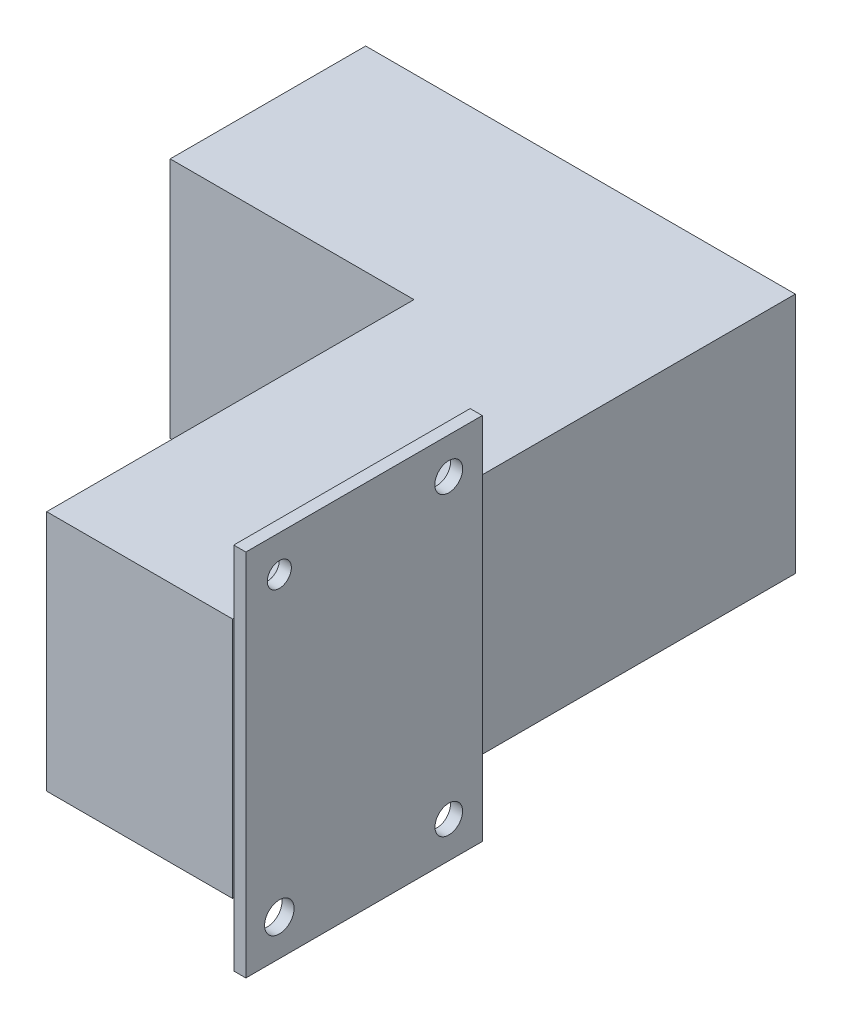
ISO-10303-21;
HEADER;
FILE_DESCRIPTION(('STEP AP214'),'2;1');
FILE_NAME('part.step','',(''),(''),'','','');
FILE_SCHEMA(('AUTOMOTIVE_DESIGN { 1 0 10303 214 1 1 1 1 }'));
ENDSEC;
DATA;
#1=APPLICATION_CONTEXT('core data for automotive mechanical design processes');
#2=APPLICATION_PROTOCOL_DEFINITION('international standard','automotive_design',2000,#1);
#3=PRODUCT_CONTEXT('',#1,'mechanical');
#4=PRODUCT('Part','Part','',(#3));
#5=PRODUCT_RELATED_PRODUCT_CATEGORY('part','',(#4));
#6=PRODUCT_DEFINITION_FORMATION('','',#4);
#7=PRODUCT_DEFINITION_CONTEXT('part definition',#1,'design');
#8=PRODUCT_DEFINITION('design','',#6,#7);
#9=PRODUCT_DEFINITION_SHAPE('','',#8);
#10=(LENGTH_UNIT() NAMED_UNIT(*) SI_UNIT(.MILLI.,.METRE.));
#11=(NAMED_UNIT(*) PLANE_ANGLE_UNIT() SI_UNIT($,.RADIAN.));
#12=(NAMED_UNIT(*) SI_UNIT($,.STERADIAN.) SOLID_ANGLE_UNIT());
#13=UNCERTAINTY_MEASURE_WITH_UNIT(LENGTH_MEASURE(1.E-05),#10,'distance_accuracy_value','');
#14=(GEOMETRIC_REPRESENTATION_CONTEXT(3) GLOBAL_UNCERTAINTY_ASSIGNED_CONTEXT((#13)) GLOBAL_UNIT_ASSIGNED_CONTEXT((#10,
#11,#12)) REPRESENTATION_CONTEXT('',''));
#15=CARTESIAN_POINT('',(0.,0.,0.));
#16=DIRECTION('',(0.,0.,1.));
#17=DIRECTION('',(1.,0.,0.));
#18=AXIS2_PLACEMENT_3D('',#15,#16,#17);
#19=CARTESIAN_POINT('',(35.5,-20.,93.));
#20=DIRECTION('',(-1.,0.,0.));
#21=DIRECTION('',(0.,0.,1.));
#22=AXIS2_PLACEMENT_3D('',#19,#20,#21);
#23=PLANE('',#22);
#24=DIRECTION('',(0.,1.,0.));
#25=VECTOR('',#24,1.);
#26=CARTESIAN_POINT('',(35.5,-20.,53.7347753333379));
#27=LINE('',#26,#25);
#28=CARTESIAN_POINT('',(35.5,-20.,53.7347753333379));
#29=VERTEX_POINT('',#28);
#30=CARTESIAN_POINT('',(35.5,20.,53.7347753333379));
#31=VERTEX_POINT('',#30);
#32=EDGE_CURVE('E61',#29,#31,#27,.T.);
#33=ORIENTED_EDGE('',*,*,#32,.F.);
#34=DIRECTION('',(0.,0.,-1.));
#35=VECTOR('',#34,1.);
#36=CARTESIAN_POINT('',(35.5,-20.,93.));
#37=LINE('',#36,#35);
#38=CARTESIAN_POINT('',(35.5,-20.,0.));
#39=VERTEX_POINT('',#38);
#40=EDGE_CURVE('E147',#29,#39,#37,.T.);
#41=ORIENTED_EDGE('',*,*,#40,.T.);
#42=DIRECTION('',(0.,1.,0.));
#43=VECTOR('',#42,1.);
#44=CARTESIAN_POINT('',(35.5,-20.,0.));
#45=LINE('',#44,#43);
#46=CARTESIAN_POINT('',(35.5,20.,0.));
#47=VERTEX_POINT('',#46);
#48=EDGE_CURVE('E153',#39,#47,#45,.T.);
#49=ORIENTED_EDGE('',*,*,#48,.T.);
#50=DIRECTION('',(0.,0.,-1.));
#51=VECTOR('',#50,1.);
#52=CARTESIAN_POINT('',(35.5,20.,93.));
#53=LINE('',#52,#51);
#54=EDGE_CURVE('E172',#31,#47,#53,.T.);
#55=ORIENTED_EDGE('',*,*,#54,.F.);
#56=EDGE_LOOP('',(#33,#41,#49,#55));
#57=FACE_BOUND('',#56,.T.);
#58=ADVANCED_FACE('F39',(#57),#23,.F.);
#59=DIRECTION('',(0.,-1.,0.));
#60=VECTOR('',#59,1.);
#61=CARTESIAN_POINT('',(35.5,-20.,92.7987415941625));
#62=LINE('',#61,#60);
#63=CARTESIAN_POINT('',(35.5,20.,92.7987415941625));
#64=VERTEX_POINT('',#63);
#65=CARTESIAN_POINT('',(35.5,-20.,92.7987415941625));
#66=VERTEX_POINT('',#65);
#67=EDGE_CURVE('E174',#64,#66,#62,.T.);
#68=ORIENTED_EDGE('',*,*,#67,.F.);
#69=CARTESIAN_POINT('',(35.5,20.,93.));
#70=VERTEX_POINT('',#69);
#71=EDGE_CURVE('E173',#70,#64,#53,.T.);
#72=ORIENTED_EDGE('',*,*,#71,.F.);
#73=DIRECTION('',(0.,1.,0.));
#74=VECTOR('',#73,1.);
#75=CARTESIAN_POINT('',(35.5,-20.,93.));
#76=LINE('',#75,#74);
#77=CARTESIAN_POINT('',(35.5,-20.,93.));
#78=VERTEX_POINT('',#77);
#79=EDGE_CURVE('E143',#78,#70,#76,.T.);
#80=ORIENTED_EDGE('',*,*,#79,.F.);
#81=EDGE_CURVE('E165',#78,#66,#37,.T.);
#82=ORIENTED_EDGE('',*,*,#81,.T.);
#83=EDGE_LOOP('',(#68,#72,#80,#82));
#84=FACE_BOUND('',#83,.T.);
#85=ADVANCED_FACE('F285',(#84),#23,.F.);
#86=CARTESIAN_POINT('',(-35.5,20.,93.));
#87=DIRECTION('',(0.,-1.,0.));
#88=DIRECTION('',(0.,0.,-1.));
#89=AXIS2_PLACEMENT_3D('',#86,#87,#88);
#90=PLANE('',#89);
#91=DIRECTION('',(0.,0.,-1.));
#92=VECTOR('',#91,1.);
#93=CARTESIAN_POINT('',(-35.5,20.,93.));
#94=LINE('',#93,#92);
#95=CARTESIAN_POINT('',(-35.5,20.,32.3048927782938));
#96=VERTEX_POINT('',#95);
#97=CARTESIAN_POINT('',(-35.5,20.,0.));
#98=VERTEX_POINT('',#97);
#99=EDGE_CURVE('E170',#96,#98,#94,.T.);
#100=ORIENTED_EDGE('',*,*,#99,.F.);
#101=DIRECTION('',(-1.,0.,0.));
#102=VECTOR('',#101,1.);
#103=CARTESIAN_POINT('',(4.7864678034472,20.,32.3048927782938));
#104=LINE('',#103,#102);
#105=CARTESIAN_POINT('',(4.7864678034472,20.,32.3048927782938));
#106=VERTEX_POINT('',#105);
#107=EDGE_CURVE('E139',#106,#96,#104,.T.);
#108=ORIENTED_EDGE('',*,*,#107,.F.);
#109=DIRECTION('',(0.,0.,-1.));
#110=VECTOR('',#109,1.);
#111=CARTESIAN_POINT('',(4.7864678034472,20.,93.));
#112=LINE('',#111,#110);
#113=CARTESIAN_POINT('',(4.7864678034472,20.,93.));
#114=VERTEX_POINT('',#113);
#115=EDGE_CURVE('E128',#114,#106,#112,.T.);
#116=ORIENTED_EDGE('',*,*,#115,.F.);
#117=DIRECTION('',(-1.,0.,0.));
#118=VECTOR('',#117,1.);
#119=CARTESIAN_POINT('',(-35.5,20.,93.));
#120=LINE('',#119,#118);
#121=EDGE_CURVE('E137',#70,#114,#120,.T.);
#122=ORIENTED_EDGE('',*,*,#121,.F.);
#123=ORIENTED_EDGE('',*,*,#71,.T.);
#124=EDGE_CURVE('E175',#64,#31,#53,.T.);
#125=ORIENTED_EDGE('',*,*,#124,.T.);
#126=ORIENTED_EDGE('',*,*,#54,.T.);
#127=DIRECTION('',(-1.,0.,0.));
#128=VECTOR('',#127,1.);
#129=CARTESIAN_POINT('',(-35.5,20.,0.));
#130=LINE('',#129,#128);
#131=EDGE_CURVE('E156',#47,#98,#130,.T.);
#132=ORIENTED_EDGE('',*,*,#131,.T.);
#133=EDGE_LOOP('',(#100,#108,#116,#122,#123,#125,#126,#132));
#134=FACE_BOUND('',#133,.T.);
#135=ADVANCED_FACE('F135',(#134),#90,.F.);
#136=CARTESIAN_POINT('',(-35.5,-20.,93.));
#137=DIRECTION('',(1.,0.,0.));
#138=DIRECTION('',(0.,0.,-1.));
#139=AXIS2_PLACEMENT_3D('',#136,#137,#138);
#140=PLANE('',#139);
#141=DIRECTION('',(0.,0.,-1.));
#142=VECTOR('',#141,1.);
#143=CARTESIAN_POINT('',(-35.5,-20.,93.));
#144=LINE('',#143,#142);
#145=CARTESIAN_POINT('',(-35.5,-20.,32.3048927782938));
#146=VERTEX_POINT('',#145);
#147=CARTESIAN_POINT('',(-35.5,-20.,0.));
#148=VERTEX_POINT('',#147);
#149=EDGE_CURVE('E167',#146,#148,#144,.T.);
#150=ORIENTED_EDGE('',*,*,#149,.F.);
#151=DIRECTION('',(0.,1.,0.));
#152=VECTOR('',#151,1.);
#153=CARTESIAN_POINT('',(-35.5,-47.,32.3048927782938));
#154=LINE('',#153,#152);
#155=EDGE_CURVE('E197',#146,#96,#154,.T.);
#156=ORIENTED_EDGE('',*,*,#155,.T.);
#157=ORIENTED_EDGE('',*,*,#99,.T.);
#158=DIRECTION('',(0.,-1.,0.));
#159=VECTOR('',#158,1.);
#160=CARTESIAN_POINT('',(-35.5,-20.,0.));
#161=LINE('',#160,#159);
#162=EDGE_CURVE('E160',#98,#148,#161,.T.);
#163=ORIENTED_EDGE('',*,*,#162,.T.);
#164=EDGE_LOOP('',(#150,#156,#157,#163));
#165=FACE_BOUND('',#164,.T.);
#166=ADVANCED_FACE('F196',(#165),#140,.F.);
#167=CARTESIAN_POINT('',(-35.5,-20.,93.));
#168=DIRECTION('',(0.,1.,0.));
#169=DIRECTION('',(0.,0.,1.));
#170=AXIS2_PLACEMENT_3D('',#167,#168,#169);
#171=PLANE('',#170);
#172=DIRECTION('',(0.,0.,-1.));
#173=VECTOR('',#172,1.);
#174=CARTESIAN_POINT('',(4.7864678034472,-20.,93.));
#175=LINE('',#174,#173);
#176=CARTESIAN_POINT('',(4.7864678034472,-20.,93.));
#177=VERTEX_POINT('',#176);
#178=CARTESIAN_POINT('',(4.7864678034472,-20.,32.3048927782938));
#179=VERTEX_POINT('',#178);
#180=EDGE_CURVE('E53',#177,#179,#175,.T.);
#181=ORIENTED_EDGE('',*,*,#180,.T.);
#182=DIRECTION('',(-1.,0.,0.));
#183=VECTOR('',#182,1.);
#184=CARTESIAN_POINT('',(-35.5,-20.,32.3048927782938));
#185=LINE('',#184,#183);
#186=EDGE_CURVE('E11',#179,#146,#185,.T.);
#187=ORIENTED_EDGE('',*,*,#186,.T.);
#188=ORIENTED_EDGE('',*,*,#149,.T.);
#189=DIRECTION('',(1.,0.,0.));
#190=VECTOR('',#189,1.);
#191=CARTESIAN_POINT('',(-35.5,-20.,0.));
#192=LINE('',#191,#190);
#193=EDGE_CURVE('E149',#148,#39,#192,.T.);
#194=ORIENTED_EDGE('',*,*,#193,.T.);
#195=ORIENTED_EDGE('',*,*,#40,.F.);
#196=EDGE_CURVE('E168',#66,#29,#37,.T.);
#197=ORIENTED_EDGE('',*,*,#196,.F.);
#198=ORIENTED_EDGE('',*,*,#81,.F.);
#199=DIRECTION('',(1.,0.,0.));
#200=VECTOR('',#199,1.);
#201=CARTESIAN_POINT('',(-35.5,-20.,93.));
#202=LINE('',#201,#200);
#203=EDGE_CURVE('E145',#177,#78,#202,.T.);
#204=ORIENTED_EDGE('',*,*,#203,.F.);
#205=EDGE_LOOP('',(#181,#187,#188,#194,#195,#197,#198,#204));
#206=FACE_BOUND('',#205,.T.);
#207=ADVANCED_FACE('F192',(#206),#171,.F.);
#208=CARTESIAN_POINT('',(0.,0.,93.));
#209=DIRECTION('',(0.,0.,-1.));
#210=DIRECTION('',(-1.,0.,0.));
#211=AXIS2_PLACEMENT_3D('',#208,#209,#210);
#212=PLANE('',#211);
#213=ORIENTED_EDGE('',*,*,#121,.T.);
#214=DIRECTION('',(0.,-1.,0.));
#215=VECTOR('',#214,1.);
#216=CARTESIAN_POINT('',(4.7864678034472,0.,93.));
#217=LINE('',#216,#215);
#218=EDGE_CURVE('E46',#114,#177,#217,.T.);
#219=ORIENTED_EDGE('',*,*,#218,.T.);
#220=ORIENTED_EDGE('',*,*,#203,.T.);
#221=ORIENTED_EDGE('',*,*,#79,.T.);
#222=EDGE_LOOP('',(#213,#219,#220,#221));
#223=FACE_BOUND('',#222,.T.);
#224=ADVANCED_FACE('F141',(#223),#212,.F.);
#225=CARTESIAN_POINT('',(0.,0.,0.));
#226=DIRECTION('',(0.,0.,-1.));
#227=DIRECTION('',(-1.,0.,0.));
#228=AXIS2_PLACEMENT_3D('',#225,#226,#227);
#229=PLANE('',#228);
#230=ORIENTED_EDGE('',*,*,#48,.F.);
#231=ORIENTED_EDGE('',*,*,#193,.F.);
#232=ORIENTED_EDGE('',*,*,#162,.F.);
#233=ORIENTED_EDGE('',*,*,#131,.F.);
#234=EDGE_LOOP('',(#230,#231,#232,#233));
#235=FACE_BOUND('',#234,.T.);
#236=ADVANCED_FACE('F187',(#235),#229,.T.);
#237=CARTESIAN_POINT('',(35.5,0.,0.));
#238=DIRECTION('',(1.,0.,0.));
#239=DIRECTION('',(0.,0.,-1.));
#240=AXIS2_PLACEMENT_3D('',#237,#238,#239);
#241=PLANE('',#240);
#242=CARTESIAN_POINT('',(35.5,-24.5,87.2667584637502));
#243=DIRECTION('',(-1.,0.,0.));
#244=DIRECTION('',(0.,0.,1.));
#245=AXIS2_PLACEMENT_3D('',#242,#243,#244);
#246=CIRCLE('',#245,2.43555370347675);
#247=CARTESIAN_POINT('',(35.5,-24.5,89.7023121672269));
#248=VERTEX_POINT('',#247);
#249=EDGE_CURVE('E209',#248,#248,#246,.T.);
#250=ORIENTED_EDGE('',*,*,#249,.F.);
#251=EDGE_LOOP('',(#250));
#252=FACE_BOUND('',#251,.T.);
#253=CARTESIAN_POINT('',(35.5,-24.5,59.2667584637502));
#254=DIRECTION('',(-1.,0.,0.));
#255=DIRECTION('',(0.,0.,1.));
#256=AXIS2_PLACEMENT_3D('',#253,#254,#255);
#257=CIRCLE('',#256,2.27958657246223);
#258=CARTESIAN_POINT('',(35.5,-24.5,61.5463450362124));
#259=VERTEX_POINT('',#258);
#260=EDGE_CURVE('E201',#259,#259,#257,.T.);
#261=ORIENTED_EDGE('',*,*,#260,.F.);
#262=EDGE_LOOP('',(#261));
#263=FACE_BOUND('',#262,.T.);
#264=CARTESIAN_POINT('',(35.5,-30.4802785253419,92.7987415941625));
#265=VERTEX_POINT('',#264);
#266=EDGE_CURVE('E181',#66,#265,#62,.T.);
#267=ORIENTED_EDGE('',*,*,#266,.F.);
#268=ORIENTED_EDGE('',*,*,#196,.T.);
#269=CARTESIAN_POINT('',(35.5,-30.4802785253419,53.7347753333379));
#270=VERTEX_POINT('',#269);
#271=EDGE_CURVE('E241',#270,#29,#27,.T.);
#272=ORIENTED_EDGE('',*,*,#271,.F.);
#273=DIRECTION('',(0.,0.,-1.));
#274=VECTOR('',#273,1.);
#275=CARTESIAN_POINT('',(35.5,-30.4802785253419,93.));
#276=LINE('',#275,#274);
#277=EDGE_CURVE('E234',#265,#270,#276,.T.);
#278=ORIENTED_EDGE('',*,*,#277,.F.);
#279=EDGE_LOOP('',(#267,#268,#272,#278));
#280=FACE_BOUND('',#279,.T.);
#281=ADVANCED_FACE('F282',(#252,#263,#280),#241,.F.);
#282=CARTESIAN_POINT('',(37.5,-20.,53.7347753333379));
#283=DIRECTION('',(0.,0.,1.));
#284=DIRECTION('',(1.,0.,0.));
#285=AXIS2_PLACEMENT_3D('',#282,#283,#284);
#286=PLANE('',#285);
#287=ORIENTED_EDGE('',*,*,#271,.T.);
#288=ORIENTED_EDGE('',*,*,#32,.T.);
#289=CARTESIAN_POINT('',(35.5,30.4802785253419,53.7347753333379));
#290=VERTEX_POINT('',#289);
#291=EDGE_CURVE('E227',#31,#290,#27,.T.);
#292=ORIENTED_EDGE('',*,*,#291,.T.);
#293=DIRECTION('',(-1.,0.,0.));
#294=VECTOR('',#293,1.);
#295=CARTESIAN_POINT('',(37.5,30.4802785253419,53.7347753333379));
#296=LINE('',#295,#294);
#297=CARTESIAN_POINT('',(37.5,30.4802785253419,53.7347753333379));
#298=VERTEX_POINT('',#297);
#299=EDGE_CURVE('E157',#298,#290,#296,.T.);
#300=ORIENTED_EDGE('',*,*,#299,.F.);
#301=DIRECTION('',(0.,1.,0.));
#302=VECTOR('',#301,1.);
#303=CARTESIAN_POINT('',(37.5,-20.,53.7347753333379));
#304=LINE('',#303,#302);
#305=CARTESIAN_POINT('',(37.5,-30.4802785253419,53.7347753333379));
#306=VERTEX_POINT('',#305);
#307=EDGE_CURVE('E230',#306,#298,#304,.T.);
#308=ORIENTED_EDGE('',*,*,#307,.F.);
#309=DIRECTION('',(-1.,0.,0.));
#310=VECTOR('',#309,1.);
#311=CARTESIAN_POINT('',(37.5,-30.4802785253419,53.7347753333379));
#312=LINE('',#311,#310);
#313=EDGE_CURVE('E240',#306,#270,#312,.T.);
#314=ORIENTED_EDGE('',*,*,#313,.T.);
#315=EDGE_LOOP('',(#287,#288,#292,#300,#308,#314));
#316=FACE_BOUND('',#315,.T.);
#317=ADVANCED_FACE('F263',(#316),#286,.F.);
#318=CARTESIAN_POINT('',(37.5,30.4802785253419,93.));
#319=DIRECTION('',(0.,-1.,0.));
#320=DIRECTION('',(0.,0.,-1.));
#321=AXIS2_PLACEMENT_3D('',#318,#319,#320);
#322=PLANE('',#321);
#323=DIRECTION('',(0.,0.,1.));
#324=VECTOR('',#323,1.);
#325=CARTESIAN_POINT('',(35.5,30.4802785253419,93.));
#326=LINE('',#325,#324);
#327=CARTESIAN_POINT('',(35.5,30.4802785253419,92.7987415941625));
#328=VERTEX_POINT('',#327);
#329=EDGE_CURVE('E244',#290,#328,#326,.T.);
#330=ORIENTED_EDGE('',*,*,#329,.T.);
#331=DIRECTION('',(-1.,0.,0.));
#332=VECTOR('',#331,1.);
#333=CARTESIAN_POINT('',(37.5,30.4802785253419,92.7987415941625));
#334=LINE('',#333,#332);
#335=CARTESIAN_POINT('',(37.5,30.4802785253419,92.7987415941625));
#336=VERTEX_POINT('',#335);
#337=EDGE_CURVE('E253',#336,#328,#334,.T.);
#338=ORIENTED_EDGE('',*,*,#337,.F.);
#339=DIRECTION('',(0.,0.,1.));
#340=VECTOR('',#339,1.);
#341=CARTESIAN_POINT('',(37.5,30.4802785253419,93.));
#342=LINE('',#341,#340);
#343=EDGE_CURVE('E233',#298,#336,#342,.T.);
#344=ORIENTED_EDGE('',*,*,#343,.F.);
#345=ORIENTED_EDGE('',*,*,#299,.T.);
#346=EDGE_LOOP('',(#330,#338,#344,#345));
#347=FACE_BOUND('',#346,.T.);
#348=ADVANCED_FACE('F258',(#347),#322,.F.);
#349=CARTESIAN_POINT('',(37.5,-20.,92.7987415941625));
#350=DIRECTION('',(0.,0.,-1.));
#351=DIRECTION('',(-1.,0.,0.));
#352=AXIS2_PLACEMENT_3D('',#349,#350,#351);
#353=PLANE('',#352);
#354=EDGE_CURVE('E180',#328,#64,#62,.T.);
#355=ORIENTED_EDGE('',*,*,#354,.T.);
#356=ORIENTED_EDGE('',*,*,#67,.T.);
#357=ORIENTED_EDGE('',*,*,#266,.T.);
#358=DIRECTION('',(-1.,0.,0.));
#359=VECTOR('',#358,1.);
#360=CARTESIAN_POINT('',(37.5,-30.4802785253419,92.7987415941625));
#361=LINE('',#360,#359);
#362=CARTESIAN_POINT('',(37.5,-30.4802785253419,92.7987415941625));
#363=VERTEX_POINT('',#362);
#364=EDGE_CURVE('E250',#363,#265,#361,.T.);
#365=ORIENTED_EDGE('',*,*,#364,.F.);
#366=DIRECTION('',(0.,-1.,0.));
#367=VECTOR('',#366,1.);
#368=CARTESIAN_POINT('',(37.5,-20.,92.7987415941625));
#369=LINE('',#368,#367);
#370=EDGE_CURVE('E236',#336,#363,#369,.T.);
#371=ORIENTED_EDGE('',*,*,#370,.F.);
#372=ORIENTED_EDGE('',*,*,#337,.T.);
#373=EDGE_LOOP('',(#355,#356,#357,#365,#371,#372));
#374=FACE_BOUND('',#373,.T.);
#375=ADVANCED_FACE('F269',(#374),#353,.F.);
#376=CARTESIAN_POINT('',(37.5,-30.4802785253419,93.));
#377=DIRECTION('',(0.,1.,0.));
#378=DIRECTION('',(0.,0.,1.));
#379=AXIS2_PLACEMENT_3D('',#376,#377,#378);
#380=PLANE('',#379);
#381=ORIENTED_EDGE('',*,*,#277,.T.);
#382=ORIENTED_EDGE('',*,*,#313,.F.);
#383=DIRECTION('',(0.,0.,-1.));
#384=VECTOR('',#383,1.);
#385=CARTESIAN_POINT('',(37.5,-30.4802785253419,93.));
#386=LINE('',#385,#384);
#387=EDGE_CURVE('E238',#363,#306,#386,.T.);
#388=ORIENTED_EDGE('',*,*,#387,.F.);
#389=ORIENTED_EDGE('',*,*,#364,.T.);
#390=EDGE_LOOP('',(#381,#382,#388,#389));
#391=FACE_BOUND('',#390,.T.);
#392=ADVANCED_FACE('F277',(#391),#380,.F.);
#393=CARTESIAN_POINT('',(37.5,0.,0.));
#394=DIRECTION('',(1.,0.,0.));
#395=DIRECTION('',(0.,0.,-1.));
#396=AXIS2_PLACEMENT_3D('',#393,#394,#395);
#397=PLANE('',#396);
#398=CARTESIAN_POINT('',(37.5,-24.5,59.2667584637502));
#399=DIRECTION('',(-1.,0.,0.));
#400=DIRECTION('',(0.,0.,1.));
#401=AXIS2_PLACEMENT_3D('',#398,#399,#400);
#402=CIRCLE('',#401,2.27958657246223);
#403=CARTESIAN_POINT('',(37.5,-24.5,61.5463450362124));
#404=VERTEX_POINT('',#403);
#405=EDGE_CURVE('E206',#404,#404,#402,.T.);
#406=ORIENTED_EDGE('',*,*,#405,.T.);
#407=EDGE_LOOP('',(#406));
#408=FACE_BOUND('',#407,.T.);
#409=CARTESIAN_POINT('',(37.5,-24.5,87.2667584637502));
#410=DIRECTION('',(-1.,0.,0.));
#411=DIRECTION('',(0.,0.,1.));
#412=AXIS2_PLACEMENT_3D('',#409,#410,#411);
#413=CIRCLE('',#412,2.43555370347675);
#414=CARTESIAN_POINT('',(37.5,-24.5,89.7023121672269));
#415=VERTEX_POINT('',#414);
#416=EDGE_CURVE('E212',#415,#415,#413,.T.);
#417=ORIENTED_EDGE('',*,*,#416,.T.);
#418=EDGE_LOOP('',(#417));
#419=FACE_BOUND('',#418,.T.);
#420=CARTESIAN_POINT('',(37.5,24.5,59.2667584637502));
#421=DIRECTION('',(-1.,0.,0.));
#422=DIRECTION('',(0.,0.,1.));
#423=AXIS2_PLACEMENT_3D('',#420,#421,#422);
#424=CIRCLE('',#423,2.30318540613895);
#425=CARTESIAN_POINT('',(37.5,24.5,61.5699438698891));
#426=VERTEX_POINT('',#425);
#427=EDGE_CURVE('E218',#426,#426,#424,.T.);
#428=ORIENTED_EDGE('',*,*,#427,.T.);
#429=EDGE_LOOP('',(#428));
#430=FACE_BOUND('',#429,.T.);
#431=CARTESIAN_POINT('',(37.5,24.5,87.2667584637502));
#432=DIRECTION('',(-1.,0.,0.));
#433=DIRECTION('',(0.,0.,1.));
#434=AXIS2_PLACEMENT_3D('',#431,#432,#433);
#435=CIRCLE('',#434,1.98680766308655);
#436=CARTESIAN_POINT('',(37.5,24.5,89.2535661268367));
#437=VERTEX_POINT('',#436);
#438=EDGE_CURVE('E224',#437,#437,#435,.T.);
#439=ORIENTED_EDGE('',*,*,#438,.T.);
#440=EDGE_LOOP('',(#439));
#441=FACE_BOUND('',#440,.T.);
#442=ORIENTED_EDGE('',*,*,#307,.T.);
#443=ORIENTED_EDGE('',*,*,#343,.T.);
#444=ORIENTED_EDGE('',*,*,#370,.T.);
#445=ORIENTED_EDGE('',*,*,#387,.T.);
#446=EDGE_LOOP('',(#442,#443,#444,#445));
#447=FACE_BOUND('',#446,.T.);
#448=ADVANCED_FACE('F274',(#408,#419,#430,#441,#447),#397,.T.);
#449=ORIENTED_EDGE('',*,*,#124,.F.);
#450=ORIENTED_EDGE('',*,*,#354,.F.);
#451=ORIENTED_EDGE('',*,*,#329,.F.);
#452=ORIENTED_EDGE('',*,*,#291,.F.);
#453=EDGE_LOOP('',(#449,#450,#451,#452));
#454=FACE_BOUND('',#453,.T.);
#455=CARTESIAN_POINT('',(35.5,24.5,59.2667584637502));
#456=DIRECTION('',(-1.,0.,0.));
#457=DIRECTION('',(0.,0.,1.));
#458=AXIS2_PLACEMENT_3D('',#455,#456,#457);
#459=CIRCLE('',#458,2.30318540613895);
#460=CARTESIAN_POINT('',(35.5,24.5,61.5699438698891));
#461=VERTEX_POINT('',#460);
#462=EDGE_CURVE('E215',#461,#461,#459,.T.);
#463=ORIENTED_EDGE('',*,*,#462,.F.);
#464=EDGE_LOOP('',(#463));
#465=FACE_BOUND('',#464,.T.);
#466=CARTESIAN_POINT('',(35.5,24.5,87.2667584637502));
#467=DIRECTION('',(-1.,0.,0.));
#468=DIRECTION('',(0.,0.,1.));
#469=AXIS2_PLACEMENT_3D('',#466,#467,#468);
#470=CIRCLE('',#469,1.98680766308655);
#471=CARTESIAN_POINT('',(35.5,24.5,89.2535661268367));
#472=VERTEX_POINT('',#471);
#473=EDGE_CURVE('E221',#472,#472,#470,.T.);
#474=ORIENTED_EDGE('',*,*,#473,.F.);
#475=EDGE_LOOP('',(#474));
#476=FACE_BOUND('',#475,.T.);
#477=ADVANCED_FACE('F266',(#454,#465,#476),#241,.F.);
#478=CARTESIAN_POINT('',(37.5,24.5,87.2667584637502));
#479=DIRECTION('',(-1.,0.,0.));
#480=DIRECTION('',(0.,0.,1.));
#481=AXIS2_PLACEMENT_3D('',#478,#479,#480);
#482=CYLINDRICAL_SURFACE('',#481,1.98680766308655);
#483=CARTESIAN_POINT('',(37.5,24.5,89.2535661268367));
#484=CARTESIAN_POINT('',(37.4791666666667,24.5,89.2535661268367));
#485=CARTESIAN_POINT('',(37.4583333333333,24.5,89.2535661268367));
#486=CARTESIAN_POINT('',(37.4166666666667,24.5,89.2535661268367));
#487=CARTESIAN_POINT('',(37.3958333333333,24.5,89.2535661268367));
#488=CARTESIAN_POINT('',(37.3541666666667,24.5,89.2535661268367));
#489=CARTESIAN_POINT('',(37.3333333333333,24.5,89.2535661268367));
#490=CARTESIAN_POINT('',(37.2916666666667,24.5,89.2535661268367));
#491=CARTESIAN_POINT('',(37.2708333333333,24.5,89.2535661268367));
#492=CARTESIAN_POINT('',(37.2291666666667,24.5,89.2535661268367));
#493=CARTESIAN_POINT('',(37.2083333333333,24.5,89.2535661268367));
#494=CARTESIAN_POINT('',(37.1666666666667,24.5,89.2535661268367));
#495=CARTESIAN_POINT('',(37.1458333333333,24.5,89.2535661268367));
#496=CARTESIAN_POINT('',(37.1041666666667,24.5,89.2535661268367));
#497=CARTESIAN_POINT('',(37.0833333333333,24.5,89.2535661268367));
#498=CARTESIAN_POINT('',(37.0416666666667,24.5,89.2535661268367));
#499=CARTESIAN_POINT('',(37.0208333333333,24.5,89.2535661268367));
#500=CARTESIAN_POINT('',(36.9791666666667,24.5,89.2535661268367));
#501=CARTESIAN_POINT('',(36.9583333333333,24.5,89.2535661268367));
#502=CARTESIAN_POINT('',(36.9166666666667,24.5,89.2535661268367));
#503=CARTESIAN_POINT('',(36.8958333333333,24.5,89.2535661268367));
#504=CARTESIAN_POINT('',(36.8541666666667,24.5,89.2535661268367));
#505=CARTESIAN_POINT('',(36.8333333333333,24.5,89.2535661268367));
#506=CARTESIAN_POINT('',(36.7916666666667,24.5,89.2535661268367));
#507=CARTESIAN_POINT('',(36.7708333333333,24.5,89.2535661268367));
#508=CARTESIAN_POINT('',(36.7291666666667,24.5,89.2535661268367));
#509=CARTESIAN_POINT('',(36.7083333333333,24.5,89.2535661268367));
#510=CARTESIAN_POINT('',(36.6666666666667,24.5,89.2535661268367));
#511=CARTESIAN_POINT('',(36.6458333333333,24.5,89.2535661268367));
#512=CARTESIAN_POINT('',(36.6041666666667,24.5,89.2535661268367));
#513=CARTESIAN_POINT('',(36.5833333333333,24.5,89.2535661268367));
#514=CARTESIAN_POINT('',(36.5416666666667,24.5,89.2535661268367));
#515=CARTESIAN_POINT('',(36.5208333333333,24.5,89.2535661268367));
#516=CARTESIAN_POINT('',(36.4791666666667,24.5,89.2535661268367));
#517=CARTESIAN_POINT('',(36.4583333333333,24.5,89.2535661268367));
#518=CARTESIAN_POINT('',(36.4166666666667,24.5,89.2535661268367));
#519=CARTESIAN_POINT('',(36.3958333333333,24.5,89.2535661268367));
#520=CARTESIAN_POINT('',(36.3541666666667,24.5,89.2535661268367));
#521=CARTESIAN_POINT('',(36.3333333333333,24.5,89.2535661268367));
#522=CARTESIAN_POINT('',(36.2916666666667,24.5,89.2535661268367));
#523=CARTESIAN_POINT('',(36.2708333333333,24.5,89.2535661268367));
#524=CARTESIAN_POINT('',(36.2291666666667,24.5,89.2535661268367));
#525=CARTESIAN_POINT('',(36.2083333333333,24.5,89.2535661268367));
#526=CARTESIAN_POINT('',(36.1666666666667,24.5,89.2535661268367));
#527=CARTESIAN_POINT('',(36.1458333333333,24.5,89.2535661268367));
#528=CARTESIAN_POINT('',(36.1041666666667,24.5,89.2535661268367));
#529=CARTESIAN_POINT('',(36.0833333333333,24.5,89.2535661268367));
#530=CARTESIAN_POINT('',(36.0416666666667,24.5,89.2535661268367));
#531=CARTESIAN_POINT('',(36.0208333333333,24.5,89.2535661268367));
#532=CARTESIAN_POINT('',(35.9791666666667,24.5,89.2535661268367));
#533=CARTESIAN_POINT('',(35.9583333333333,24.5,89.2535661268367));
#534=CARTESIAN_POINT('',(35.9166666666667,24.5,89.2535661268367));
#535=CARTESIAN_POINT('',(35.8958333333333,24.5,89.2535661268367));
#536=CARTESIAN_POINT('',(35.8541666666667,24.5,89.2535661268367));
#537=CARTESIAN_POINT('',(35.8333333333333,24.5,89.2535661268367));
#538=CARTESIAN_POINT('',(35.7916666666667,24.5,89.2535661268367));
#539=CARTESIAN_POINT('',(35.7708333333333,24.5,89.2535661268367));
#540=CARTESIAN_POINT('',(35.7291666666667,24.5,89.2535661268367));
#541=CARTESIAN_POINT('',(35.7083333333333,24.5,89.2535661268367));
#542=CARTESIAN_POINT('',(35.6666666666667,24.5,89.2535661268367));
#543=CARTESIAN_POINT('',(35.6458333333333,24.5,89.2535661268367));
#544=CARTESIAN_POINT('',(35.6041666666667,24.5,89.2535661268367));
#545=CARTESIAN_POINT('',(35.5833333333333,24.5,89.2535661268367));
#546=CARTESIAN_POINT('',(35.5416666666667,24.5,89.2535661268367));
#547=CARTESIAN_POINT('',(35.5208333333333,24.5,89.2535661268367));
#548=CARTESIAN_POINT('',(35.5,24.5,89.2535661268367));
#549=B_SPLINE_CURVE_WITH_KNOTS('',3,(#483,#484,#485,#486,#487,#488,#489,#490,#491,#492,#493,
#494,#495,#496,#497,#498,#499,#500,#501,#502,#503,#504,#505,#506,#507,#508,#509,#510,#511,#512,
#513,#514,#515,#516,#517,#518,#519,#520,#521,#522,#523,#524,#525,#526,#527,#528,#529,#530,#531,
#532,#533,#534,#535,#536,#537,#538,#539,#540,#541,#542,#543,#544,#545,#546,#547,#548),
.UNSPECIFIED.,.F.,.F.,(4,2,2,2,2,2,2,2,2,2,2,2,2,2,2,2,2,2,2,2,2,2,2,2,2,2,2,2,2,2,2,2,4),(0.,
0.062500000000007,0.125,0.187500000000007,0.25,0.312500000000007,0.375,0.437500000000007,0.5,
0.562500000000007,0.625000000000001,0.687500000000008,0.750000000000001,0.812500000000008,
0.875000000000001,0.937500000000008,1.,1.06250000000001,1.125,1.18750000000001,1.25,
1.31250000000001,1.375,1.43750000000001,1.5,1.56250000000001,1.625,1.68750000000001,1.75,
1.81250000000001,1.875,1.93750000000001,2.),.UNSPECIFIED.);
#550=EDGE_CURVE('BSEAM371',#437,#472,#549,.T.);
#551=ORIENTED_EDGE('',*,*,#438,.F.);
#552=ORIENTED_EDGE('',*,*,#473,.T.);
#553=ORIENTED_EDGE('',*,*,#550,.T.);
#554=ORIENTED_EDGE('',*,*,#550,.F.);
#555=EDGE_LOOP('',(#551,#553,#552,#554));
#556=FACE_BOUND('',#555,.T.);
#557=ADVANCED_FACE('F371',(#556),#482,.F.);
#558=CARTESIAN_POINT('',(37.5,24.5,59.2667584637502));
#559=DIRECTION('',(-1.,0.,0.));
#560=DIRECTION('',(0.,0.,1.));
#561=AXIS2_PLACEMENT_3D('',#558,#559,#560);
#562=CYLINDRICAL_SURFACE('',#561,2.30318540613895);
#563=CARTESIAN_POINT('',(37.5,24.5,61.5699438698891));
#564=CARTESIAN_POINT('',(37.4791666666667,24.5,61.5699438698891));
#565=CARTESIAN_POINT('',(37.4583333333333,24.5,61.5699438698891));
#566=CARTESIAN_POINT('',(37.4166666666667,24.5,61.5699438698891));
#567=CARTESIAN_POINT('',(37.3958333333333,24.5,61.5699438698891));
#568=CARTESIAN_POINT('',(37.3541666666667,24.5,61.5699438698891));
#569=CARTESIAN_POINT('',(37.3333333333333,24.5,61.5699438698891));
#570=CARTESIAN_POINT('',(37.2916666666667,24.5,61.5699438698891));
#571=CARTESIAN_POINT('',(37.2708333333333,24.5,61.5699438698891));
#572=CARTESIAN_POINT('',(37.2291666666667,24.5,61.5699438698891));
#573=CARTESIAN_POINT('',(37.2083333333333,24.5,61.5699438698891));
#574=CARTESIAN_POINT('',(37.1666666666667,24.5,61.5699438698891));
#575=CARTESIAN_POINT('',(37.1458333333333,24.5,61.5699438698891));
#576=CARTESIAN_POINT('',(37.1041666666667,24.5,61.5699438698891));
#577=CARTESIAN_POINT('',(37.0833333333333,24.5,61.5699438698891));
#578=CARTESIAN_POINT('',(37.0416666666667,24.5,61.5699438698891));
#579=CARTESIAN_POINT('',(37.0208333333333,24.5,61.5699438698891));
#580=CARTESIAN_POINT('',(36.9791666666667,24.5,61.5699438698891));
#581=CARTESIAN_POINT('',(36.9583333333333,24.5,61.5699438698891));
#582=CARTESIAN_POINT('',(36.9166666666667,24.5,61.5699438698891));
#583=CARTESIAN_POINT('',(36.8958333333333,24.5,61.5699438698891));
#584=CARTESIAN_POINT('',(36.8541666666667,24.5,61.5699438698891));
#585=CARTESIAN_POINT('',(36.8333333333333,24.5,61.5699438698891));
#586=CARTESIAN_POINT('',(36.7916666666667,24.5,61.5699438698891));
#587=CARTESIAN_POINT('',(36.7708333333333,24.5,61.5699438698891));
#588=CARTESIAN_POINT('',(36.7291666666667,24.5,61.5699438698891));
#589=CARTESIAN_POINT('',(36.7083333333333,24.5,61.5699438698891));
#590=CARTESIAN_POINT('',(36.6666666666667,24.5,61.5699438698891));
#591=CARTESIAN_POINT('',(36.6458333333333,24.5,61.5699438698891));
#592=CARTESIAN_POINT('',(36.6041666666667,24.5,61.5699438698891));
#593=CARTESIAN_POINT('',(36.5833333333333,24.5,61.5699438698891));
#594=CARTESIAN_POINT('',(36.5416666666667,24.5,61.5699438698891));
#595=CARTESIAN_POINT('',(36.5208333333333,24.5,61.5699438698891));
#596=CARTESIAN_POINT('',(36.4791666666667,24.5,61.5699438698891));
#597=CARTESIAN_POINT('',(36.4583333333333,24.5,61.5699438698891));
#598=CARTESIAN_POINT('',(36.4166666666667,24.5,61.5699438698891));
#599=CARTESIAN_POINT('',(36.3958333333333,24.5,61.5699438698891));
#600=CARTESIAN_POINT('',(36.3541666666667,24.5,61.5699438698891));
#601=CARTESIAN_POINT('',(36.3333333333333,24.5,61.5699438698891));
#602=CARTESIAN_POINT('',(36.2916666666667,24.5,61.5699438698891));
#603=CARTESIAN_POINT('',(36.2708333333333,24.5,61.5699438698891));
#604=CARTESIAN_POINT('',(36.2291666666667,24.5,61.5699438698891));
#605=CARTESIAN_POINT('',(36.2083333333333,24.5,61.5699438698891));
#606=CARTESIAN_POINT('',(36.1666666666667,24.5,61.5699438698891));
#607=CARTESIAN_POINT('',(36.1458333333333,24.5,61.5699438698891));
#608=CARTESIAN_POINT('',(36.1041666666667,24.5,61.5699438698891));
#609=CARTESIAN_POINT('',(36.0833333333333,24.5,61.5699438698891));
#610=CARTESIAN_POINT('',(36.0416666666667,24.5,61.5699438698891));
#611=CARTESIAN_POINT('',(36.0208333333333,24.5,61.5699438698891));
#612=CARTESIAN_POINT('',(35.9791666666667,24.5,61.5699438698891));
#613=CARTESIAN_POINT('',(35.9583333333333,24.5,61.5699438698891));
#614=CARTESIAN_POINT('',(35.9166666666667,24.5,61.5699438698891));
#615=CARTESIAN_POINT('',(35.8958333333333,24.5,61.5699438698891));
#616=CARTESIAN_POINT('',(35.8541666666667,24.5,61.5699438698891));
#617=CARTESIAN_POINT('',(35.8333333333333,24.5,61.5699438698891));
#618=CARTESIAN_POINT('',(35.7916666666667,24.5,61.5699438698891));
#619=CARTESIAN_POINT('',(35.7708333333333,24.5,61.5699438698891));
#620=CARTESIAN_POINT('',(35.7291666666667,24.5,61.5699438698891));
#621=CARTESIAN_POINT('',(35.7083333333333,24.5,61.5699438698891));
#622=CARTESIAN_POINT('',(35.6666666666667,24.5,61.5699438698891));
#623=CARTESIAN_POINT('',(35.6458333333333,24.5,61.5699438698891));
#624=CARTESIAN_POINT('',(35.6041666666667,24.5,61.5699438698891));
#625=CARTESIAN_POINT('',(35.5833333333333,24.5,61.5699438698891));
#626=CARTESIAN_POINT('',(35.5416666666667,24.5,61.5699438698891));
#627=CARTESIAN_POINT('',(35.5208333333333,24.5,61.5699438698891));
#628=CARTESIAN_POINT('',(35.5,24.5,61.5699438698891));
#629=B_SPLINE_CURVE_WITH_KNOTS('',3,(#563,#564,#565,#566,#567,#568,#569,#570,#571,#572,#573,
#574,#575,#576,#577,#578,#579,#580,#581,#582,#583,#584,#585,#586,#587,#588,#589,#590,#591,#592,
#593,#594,#595,#596,#597,#598,#599,#600,#601,#602,#603,#604,#605,#606,#607,#608,#609,#610,#611,
#612,#613,#614,#615,#616,#617,#618,#619,#620,#621,#622,#623,#624,#625,#626,#627,#628),
.UNSPECIFIED.,.F.,.F.,(4,2,2,2,2,2,2,2,2,2,2,2,2,2,2,2,2,2,2,2,2,2,2,2,2,2,2,2,2,2,2,2,4),(0.,
0.0625000000000001,0.124999999999993,0.1875,0.249999999999993,0.3125,0.374999999999993,0.4375,
0.499999999999994,0.5625,0.624999999999994,0.687500000000001,0.749999999999994,
0.812500000000001,0.874999999999994,0.937500000000001,0.999999999999994,1.0625,1.12499999999999,
1.1875,1.24999999999999,1.3125,1.37499999999999,1.4375,1.49999999999999,1.5625,1.62499999999999,
1.6875,1.74999999999999,1.8125,1.87499999999999,1.9375,1.99999999999999),.UNSPECIFIED.);
#630=EDGE_CURVE('BSEAM379',#426,#461,#629,.T.);
#631=ORIENTED_EDGE('',*,*,#427,.F.);
#632=ORIENTED_EDGE('',*,*,#462,.T.);
#633=ORIENTED_EDGE('',*,*,#630,.T.);
#634=ORIENTED_EDGE('',*,*,#630,.F.);
#635=EDGE_LOOP('',(#631,#633,#632,#634));
#636=FACE_BOUND('',#635,.T.);
#637=ADVANCED_FACE('F379',(#636),#562,.F.);
#638=CARTESIAN_POINT('',(37.5,-24.5,87.2667584637502));
#639=DIRECTION('',(-1.,0.,0.));
#640=DIRECTION('',(0.,0.,1.));
#641=AXIS2_PLACEMENT_3D('',#638,#639,#640);
#642=CYLINDRICAL_SURFACE('',#641,2.43555370347675);
#643=CARTESIAN_POINT('',(37.5,-24.5,89.7023121672269));
#644=CARTESIAN_POINT('',(37.4791666666667,-24.5,89.7023121672269));
#645=CARTESIAN_POINT('',(37.4583333333333,-24.5,89.7023121672269));
#646=CARTESIAN_POINT('',(37.4166666666667,-24.5,89.7023121672269));
#647=CARTESIAN_POINT('',(37.3958333333333,-24.5,89.7023121672269));
#648=CARTESIAN_POINT('',(37.3541666666667,-24.5,89.7023121672269));
#649=CARTESIAN_POINT('',(37.3333333333333,-24.5,89.7023121672269));
#650=CARTESIAN_POINT('',(37.2916666666667,-24.5,89.7023121672269));
#651=CARTESIAN_POINT('',(37.2708333333333,-24.5,89.7023121672269));
#652=CARTESIAN_POINT('',(37.2291666666667,-24.5,89.7023121672269));
#653=CARTESIAN_POINT('',(37.2083333333333,-24.5,89.7023121672269));
#654=CARTESIAN_POINT('',(37.1666666666667,-24.5,89.7023121672269));
#655=CARTESIAN_POINT('',(37.1458333333333,-24.5,89.7023121672269));
#656=CARTESIAN_POINT('',(37.1041666666667,-24.5,89.7023121672269));
#657=CARTESIAN_POINT('',(37.0833333333333,-24.5,89.7023121672269));
#658=CARTESIAN_POINT('',(37.0416666666667,-24.5,89.7023121672269));
#659=CARTESIAN_POINT('',(37.0208333333333,-24.5,89.7023121672269));
#660=CARTESIAN_POINT('',(36.9791666666667,-24.5,89.7023121672269));
#661=CARTESIAN_POINT('',(36.9583333333333,-24.5,89.7023121672269));
#662=CARTESIAN_POINT('',(36.9166666666667,-24.5,89.7023121672269));
#663=CARTESIAN_POINT('',(36.8958333333333,-24.5,89.7023121672269));
#664=CARTESIAN_POINT('',(36.8541666666667,-24.5,89.7023121672269));
#665=CARTESIAN_POINT('',(36.8333333333333,-24.5,89.7023121672269));
#666=CARTESIAN_POINT('',(36.7916666666667,-24.5,89.7023121672269));
#667=CARTESIAN_POINT('',(36.7708333333333,-24.5,89.7023121672269));
#668=CARTESIAN_POINT('',(36.7291666666667,-24.5,89.7023121672269));
#669=CARTESIAN_POINT('',(36.7083333333333,-24.5,89.7023121672269));
#670=CARTESIAN_POINT('',(36.6666666666667,-24.5,89.7023121672269));
#671=CARTESIAN_POINT('',(36.6458333333333,-24.5,89.7023121672269));
#672=CARTESIAN_POINT('',(36.6041666666667,-24.5,89.7023121672269));
#673=CARTESIAN_POINT('',(36.5833333333333,-24.5,89.7023121672269));
#674=CARTESIAN_POINT('',(36.5416666666667,-24.5,89.7023121672269));
#675=CARTESIAN_POINT('',(36.5208333333333,-24.5,89.7023121672269));
#676=CARTESIAN_POINT('',(36.4791666666667,-24.5,89.7023121672269));
#677=CARTESIAN_POINT('',(36.4583333333333,-24.5,89.7023121672269));
#678=CARTESIAN_POINT('',(36.4166666666667,-24.5,89.7023121672269));
#679=CARTESIAN_POINT('',(36.3958333333333,-24.5,89.7023121672269));
#680=CARTESIAN_POINT('',(36.3541666666667,-24.5,89.7023121672269));
#681=CARTESIAN_POINT('',(36.3333333333333,-24.5,89.7023121672269));
#682=CARTESIAN_POINT('',(36.2916666666667,-24.5,89.7023121672269));
#683=CARTESIAN_POINT('',(36.2708333333333,-24.5,89.7023121672269));
#684=CARTESIAN_POINT('',(36.2291666666667,-24.5,89.7023121672269));
#685=CARTESIAN_POINT('',(36.2083333333333,-24.5,89.7023121672269));
#686=CARTESIAN_POINT('',(36.1666666666667,-24.5,89.7023121672269));
#687=CARTESIAN_POINT('',(36.1458333333333,-24.5,89.7023121672269));
#688=CARTESIAN_POINT('',(36.1041666666667,-24.5,89.7023121672269));
#689=CARTESIAN_POINT('',(36.0833333333333,-24.5,89.7023121672269));
#690=CARTESIAN_POINT('',(36.0416666666667,-24.5,89.7023121672269));
#691=CARTESIAN_POINT('',(36.0208333333333,-24.5,89.7023121672269));
#692=CARTESIAN_POINT('',(35.9791666666667,-24.5,89.7023121672269));
#693=CARTESIAN_POINT('',(35.9583333333333,-24.5,89.7023121672269));
#694=CARTESIAN_POINT('',(35.9166666666667,-24.5,89.7023121672269));
#695=CARTESIAN_POINT('',(35.8958333333333,-24.5,89.7023121672269));
#696=CARTESIAN_POINT('',(35.8541666666667,-24.5,89.7023121672269));
#697=CARTESIAN_POINT('',(35.8333333333333,-24.5,89.7023121672269));
#698=CARTESIAN_POINT('',(35.7916666666667,-24.5,89.7023121672269));
#699=CARTESIAN_POINT('',(35.7708333333333,-24.5,89.7023121672269));
#700=CARTESIAN_POINT('',(35.7291666666667,-24.5,89.7023121672269));
#701=CARTESIAN_POINT('',(35.7083333333333,-24.5,89.7023121672269));
#702=CARTESIAN_POINT('',(35.6666666666667,-24.5,89.7023121672269));
#703=CARTESIAN_POINT('',(35.6458333333333,-24.5,89.7023121672269));
#704=CARTESIAN_POINT('',(35.6041666666667,-24.5,89.7023121672269));
#705=CARTESIAN_POINT('',(35.5833333333333,-24.5,89.7023121672269));
#706=CARTESIAN_POINT('',(35.5416666666667,-24.5,89.7023121672269));
#707=CARTESIAN_POINT('',(35.5208333333333,-24.5,89.7023121672269));
#708=CARTESIAN_POINT('',(35.5,-24.5,89.7023121672269));
#709=B_SPLINE_CURVE_WITH_KNOTS('',3,(#643,#644,#645,#646,#647,#648,#649,#650,#651,#652,#653,
#654,#655,#656,#657,#658,#659,#660,#661,#662,#663,#664,#665,#666,#667,#668,#669,#670,#671,#672,
#673,#674,#675,#676,#677,#678,#679,#680,#681,#682,#683,#684,#685,#686,#687,#688,#689,#690,#691,
#692,#693,#694,#695,#696,#697,#698,#699,#700,#701,#702,#703,#704,#705,#706,#707,#708),
.UNSPECIFIED.,.F.,.F.,(4,2,2,2,2,2,2,2,2,2,2,2,2,2,2,2,2,2,2,2,2,2,2,2,2,2,2,2,2,2,2,2,4),(0.,
0.062500000000007,0.125,0.187500000000007,0.25,0.312500000000007,0.375,0.437500000000007,0.5,
0.562500000000007,0.625000000000001,0.687500000000008,0.750000000000001,0.812500000000008,
0.875000000000001,0.937500000000008,1.,1.06250000000001,1.125,1.18750000000001,1.25,
1.31250000000001,1.375,1.43750000000001,1.5,1.56250000000001,1.625,1.68750000000001,1.75,
1.81250000000001,1.875,1.93750000000001,2.),.UNSPECIFIED.);
#710=EDGE_CURVE('BSEAM389',#415,#248,#709,.T.);
#711=ORIENTED_EDGE('',*,*,#416,.F.);
#712=ORIENTED_EDGE('',*,*,#249,.T.);
#713=ORIENTED_EDGE('',*,*,#710,.T.);
#714=ORIENTED_EDGE('',*,*,#710,.F.);
#715=EDGE_LOOP('',(#711,#713,#712,#714));
#716=FACE_BOUND('',#715,.T.);
#717=ADVANCED_FACE('F389',(#716),#642,.F.);
#718=CARTESIAN_POINT('',(37.5,-24.5,59.2667584637502));
#719=DIRECTION('',(-1.,0.,0.));
#720=DIRECTION('',(0.,0.,1.));
#721=AXIS2_PLACEMENT_3D('',#718,#719,#720);
#722=CYLINDRICAL_SURFACE('',#721,2.27958657246223);
#723=CARTESIAN_POINT('',(37.5,-24.5,61.5463450362124));
#724=CARTESIAN_POINT('',(37.4791666666667,-24.5,61.5463450362124));
#725=CARTESIAN_POINT('',(37.4583333333333,-24.5,61.5463450362124));
#726=CARTESIAN_POINT('',(37.4166666666667,-24.5,61.5463450362124));
#727=CARTESIAN_POINT('',(37.3958333333333,-24.5,61.5463450362124));
#728=CARTESIAN_POINT('',(37.3541666666667,-24.5,61.5463450362124));
#729=CARTESIAN_POINT('',(37.3333333333333,-24.5,61.5463450362124));
#730=CARTESIAN_POINT('',(37.2916666666667,-24.5,61.5463450362124));
#731=CARTESIAN_POINT('',(37.2708333333333,-24.5,61.5463450362124));
#732=CARTESIAN_POINT('',(37.2291666666667,-24.5,61.5463450362124));
#733=CARTESIAN_POINT('',(37.2083333333333,-24.5,61.5463450362124));
#734=CARTESIAN_POINT('',(37.1666666666667,-24.5,61.5463450362124));
#735=CARTESIAN_POINT('',(37.1458333333333,-24.5,61.5463450362124));
#736=CARTESIAN_POINT('',(37.1041666666667,-24.5,61.5463450362124));
#737=CARTESIAN_POINT('',(37.0833333333333,-24.5,61.5463450362124));
#738=CARTESIAN_POINT('',(37.0416666666667,-24.5,61.5463450362124));
#739=CARTESIAN_POINT('',(37.0208333333333,-24.5,61.5463450362124));
#740=CARTESIAN_POINT('',(36.9791666666667,-24.5,61.5463450362124));
#741=CARTESIAN_POINT('',(36.9583333333333,-24.5,61.5463450362124));
#742=CARTESIAN_POINT('',(36.9166666666667,-24.5,61.5463450362124));
#743=CARTESIAN_POINT('',(36.8958333333333,-24.5,61.5463450362124));
#744=CARTESIAN_POINT('',(36.8541666666667,-24.5,61.5463450362124));
#745=CARTESIAN_POINT('',(36.8333333333333,-24.5,61.5463450362124));
#746=CARTESIAN_POINT('',(36.7916666666667,-24.5,61.5463450362124));
#747=CARTESIAN_POINT('',(36.7708333333333,-24.5,61.5463450362124));
#748=CARTESIAN_POINT('',(36.7291666666667,-24.5,61.5463450362124));
#749=CARTESIAN_POINT('',(36.7083333333333,-24.5,61.5463450362124));
#750=CARTESIAN_POINT('',(36.6666666666667,-24.5,61.5463450362124));
#751=CARTESIAN_POINT('',(36.6458333333333,-24.5,61.5463450362124));
#752=CARTESIAN_POINT('',(36.6041666666667,-24.5,61.5463450362124));
#753=CARTESIAN_POINT('',(36.5833333333333,-24.5,61.5463450362124));
#754=CARTESIAN_POINT('',(36.5416666666667,-24.5,61.5463450362124));
#755=CARTESIAN_POINT('',(36.5208333333333,-24.5,61.5463450362124));
#756=CARTESIAN_POINT('',(36.4791666666667,-24.5,61.5463450362124));
#757=CARTESIAN_POINT('',(36.4583333333333,-24.5,61.5463450362124));
#758=CARTESIAN_POINT('',(36.4166666666667,-24.5,61.5463450362124));
#759=CARTESIAN_POINT('',(36.3958333333333,-24.5,61.5463450362124));
#760=CARTESIAN_POINT('',(36.3541666666667,-24.5,61.5463450362124));
#761=CARTESIAN_POINT('',(36.3333333333333,-24.5,61.5463450362124));
#762=CARTESIAN_POINT('',(36.2916666666667,-24.5,61.5463450362124));
#763=CARTESIAN_POINT('',(36.2708333333333,-24.5,61.5463450362124));
#764=CARTESIAN_POINT('',(36.2291666666667,-24.5,61.5463450362124));
#765=CARTESIAN_POINT('',(36.2083333333333,-24.5,61.5463450362124));
#766=CARTESIAN_POINT('',(36.1666666666667,-24.5,61.5463450362124));
#767=CARTESIAN_POINT('',(36.1458333333333,-24.5,61.5463450362124));
#768=CARTESIAN_POINT('',(36.1041666666667,-24.5,61.5463450362124));
#769=CARTESIAN_POINT('',(36.0833333333333,-24.5,61.5463450362124));
#770=CARTESIAN_POINT('',(36.0416666666667,-24.5,61.5463450362124));
#771=CARTESIAN_POINT('',(36.0208333333333,-24.5,61.5463450362124));
#772=CARTESIAN_POINT('',(35.9791666666667,-24.5,61.5463450362124));
#773=CARTESIAN_POINT('',(35.9583333333333,-24.5,61.5463450362124));
#774=CARTESIAN_POINT('',(35.9166666666667,-24.5,61.5463450362124));
#775=CARTESIAN_POINT('',(35.8958333333333,-24.5,61.5463450362124));
#776=CARTESIAN_POINT('',(35.8541666666667,-24.5,61.5463450362124));
#777=CARTESIAN_POINT('',(35.8333333333333,-24.5,61.5463450362124));
#778=CARTESIAN_POINT('',(35.7916666666667,-24.5,61.5463450362124));
#779=CARTESIAN_POINT('',(35.7708333333333,-24.5,61.5463450362124));
#780=CARTESIAN_POINT('',(35.7291666666667,-24.5,61.5463450362124));
#781=CARTESIAN_POINT('',(35.7083333333333,-24.5,61.5463450362124));
#782=CARTESIAN_POINT('',(35.6666666666667,-24.5,61.5463450362124));
#783=CARTESIAN_POINT('',(35.6458333333333,-24.5,61.5463450362124));
#784=CARTESIAN_POINT('',(35.6041666666667,-24.5,61.5463450362124));
#785=CARTESIAN_POINT('',(35.5833333333333,-24.5,61.5463450362124));
#786=CARTESIAN_POINT('',(35.5416666666667,-24.5,61.5463450362124));
#787=CARTESIAN_POINT('',(35.5208333333333,-24.5,61.5463450362124));
#788=CARTESIAN_POINT('',(35.5,-24.5,61.5463450362124));
#789=B_SPLINE_CURVE_WITH_KNOTS('',3,(#723,#724,#725,#726,#727,#728,#729,#730,#731,#732,#733,
#734,#735,#736,#737,#738,#739,#740,#741,#742,#743,#744,#745,#746,#747,#748,#749,#750,#751,#752,
#753,#754,#755,#756,#757,#758,#759,#760,#761,#762,#763,#764,#765,#766,#767,#768,#769,#770,#771,
#772,#773,#774,#775,#776,#777,#778,#779,#780,#781,#782,#783,#784,#785,#786,#787,#788),
.UNSPECIFIED.,.F.,.F.,(4,2,2,2,2,2,2,2,2,2,2,2,2,2,2,2,2,2,2,2,2,2,2,2,2,2,2,2,2,2,2,2,4),(0.,
0.0625000000000001,0.124999999999993,0.1875,0.249999999999993,0.3125,0.374999999999993,0.4375,
0.499999999999994,0.5625,0.624999999999994,0.687500000000001,0.749999999999994,
0.812500000000001,0.874999999999994,0.937500000000001,0.999999999999994,1.0625,1.12499999999999,
1.1875,1.24999999999999,1.3125,1.37499999999999,1.4375,1.49999999999999,1.5625,1.62499999999999,
1.6875,1.74999999999999,1.8125,1.87499999999999,1.9375,1.99999999999999),.UNSPECIFIED.);
#790=EDGE_CURVE('BSEAM399',#404,#259,#789,.T.);
#791=ORIENTED_EDGE('',*,*,#405,.F.);
#792=ORIENTED_EDGE('',*,*,#260,.T.);
#793=ORIENTED_EDGE('',*,*,#790,.T.);
#794=ORIENTED_EDGE('',*,*,#790,.F.);
#795=EDGE_LOOP('',(#791,#793,#792,#794));
#796=FACE_BOUND('',#795,.T.);
#797=ADVANCED_FACE('F399',(#796),#722,.F.);
#798=CARTESIAN_POINT('',(4.7864678034472,-47.,32.3048927782938));
#799=DIRECTION('',(0.,0.,-1.));
#800=DIRECTION('',(-1.,0.,0.));
#801=AXIS2_PLACEMENT_3D('',#798,#799,#800);
#802=PLANE('',#801);
#803=DIRECTION('',(0.,1.,0.));
#804=VECTOR('',#803,1.);
#805=CARTESIAN_POINT('',(4.7864678034472,-47.,32.3048927782938));
#806=LINE('',#805,#804);
#807=EDGE_CURVE('E199',#179,#106,#806,.T.);
#808=ORIENTED_EDGE('',*,*,#807,.T.);
#809=ORIENTED_EDGE('',*,*,#107,.T.);
#810=ORIENTED_EDGE('',*,*,#155,.F.);
#811=ORIENTED_EDGE('',*,*,#186,.F.);
#812=EDGE_LOOP('',(#808,#809,#810,#811));
#813=FACE_BOUND('',#812,.T.);
#814=ADVANCED_FACE('F409',(#813),#802,.F.);
#815=CARTESIAN_POINT('',(4.7864678034472,-47.,93.));
#816=DIRECTION('',(1.,0.,0.));
#817=DIRECTION('',(0.,0.,-1.));
#818=AXIS2_PLACEMENT_3D('',#815,#816,#817);
#819=PLANE('',#818);
#820=ORIENTED_EDGE('',*,*,#218,.F.);
#821=ORIENTED_EDGE('',*,*,#115,.T.);
#822=ORIENTED_EDGE('',*,*,#807,.F.);
#823=ORIENTED_EDGE('',*,*,#180,.F.);
#824=EDGE_LOOP('',(#820,#821,#822,#823));
#825=FACE_BOUND('',#824,.T.);
#826=ADVANCED_FACE('F127',(#825),#819,.F.);
#827=CLOSED_SHELL('',(#58,#85,#135,#166,#207,#224,#236,#281,#317,#348,#375,#392,#448,#477,#557,
#637,#717,#797,#814,#826));
#828=MANIFOLD_SOLID_BREP('B2',#827);
#829=ADVANCED_BREP_SHAPE_REPRESENTATION('',(#18,#828),#14);
#830=SHAPE_DEFINITION_REPRESENTATION(#9,#829);
ENDSEC;
END-ISO-10303-21;
